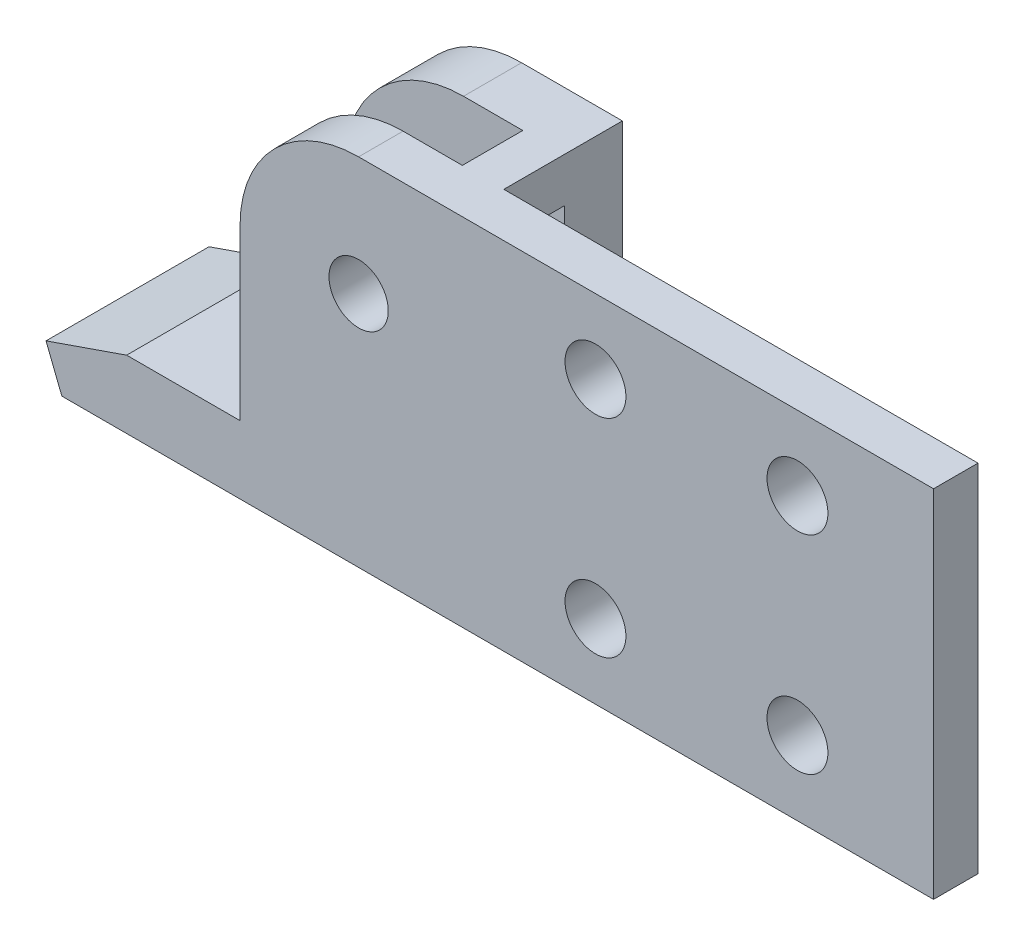
ISO-10303-21;
HEADER;
FILE_DESCRIPTION(('STEP AP214'),'2;1');
FILE_NAME('part.step','',(''),(''),'','','');
FILE_SCHEMA(('AUTOMOTIVE_DESIGN { 1 0 10303 214 1 1 1 1 }'));
ENDSEC;
DATA;
#1=APPLICATION_CONTEXT('core data for automotive mechanical design processes');
#2=APPLICATION_PROTOCOL_DEFINITION('international standard','automotive_design',2000,#1);
#3=PRODUCT_CONTEXT('',#1,'mechanical');
#4=PRODUCT('Part','Part','',(#3));
#5=PRODUCT_RELATED_PRODUCT_CATEGORY('part','',(#4));
#6=PRODUCT_DEFINITION_FORMATION('','',#4);
#7=PRODUCT_DEFINITION_CONTEXT('part definition',#1,'design');
#8=PRODUCT_DEFINITION('design','',#6,#7);
#9=PRODUCT_DEFINITION_SHAPE('','',#8);
#10=(LENGTH_UNIT() NAMED_UNIT(*) SI_UNIT(.MILLI.,.METRE.));
#11=(NAMED_UNIT(*) PLANE_ANGLE_UNIT() SI_UNIT($,.RADIAN.));
#12=(NAMED_UNIT(*) SI_UNIT($,.STERADIAN.) SOLID_ANGLE_UNIT());
#13=UNCERTAINTY_MEASURE_WITH_UNIT(LENGTH_MEASURE(1.E-05),#10,'distance_accuracy_value','');
#14=(GEOMETRIC_REPRESENTATION_CONTEXT(3) GLOBAL_UNCERTAINTY_ASSIGNED_CONTEXT((#13)) GLOBAL_UNIT_ASSIGNED_CONTEXT((#10,
#11,#12)) REPRESENTATION_CONTEXT('',''));
#15=CARTESIAN_POINT('',(0.,0.,0.));
#16=DIRECTION('',(0.,0.,1.));
#17=DIRECTION('',(1.,0.,0.));
#18=AXIS2_PLACEMENT_3D('',#15,#16,#17);
#19=CARTESIAN_POINT('',(-24.7650000000009,0.,-6.47700000000003));
#20=DIRECTION('',(0.,0.,-1.));
#21=DIRECTION('',(0.,1.,0.));
#22=AXIS2_PLACEMENT_3D('',#19,#20,#21);
#23=PLANE('',#22);
#24=DIRECTION('',(0.,-1.,0.));
#25=VECTOR('',#24,1.);
#26=CARTESIAN_POINT('',(-48.8950000000009,0.,-6.47700000000003));
#27=LINE('',#26,#25);
#28=CARTESIAN_POINT('',(-48.895000000001,-203.1333598559,-6.477));
#29=VERTEX_POINT('',#28);
#30=CARTESIAN_POINT('',(-48.895000000001,-217.052510473162,-6.477));
#31=VERTEX_POINT('',#30);
#32=EDGE_CURVE('E285',#29,#31,#27,.T.);
#33=ORIENTED_EDGE('',*,*,#32,.T.);
#34=DIRECTION('',(-1.,0.,0.));
#35=VECTOR('',#34,1.);
#36=CARTESIAN_POINT('',(-24.765000000001,-217.052510473162,-6.477));
#37=LINE('',#36,#35);
#38=CARTESIAN_POINT('',(-25.4000000000009,-217.052510473162,-6.477));
#39=VERTEX_POINT('',#38);
#40=EDGE_CURVE('E61',#39,#31,#37,.T.);
#41=ORIENTED_EDGE('',*,*,#40,.F.);
#42=DIRECTION('',(0.,-1.,0.));
#43=VECTOR('',#42,1.);
#44=CARTESIAN_POINT('',(-25.4000000000009,-190.4333598559,-6.477));
#45=LINE('',#44,#43);
#46=CARTESIAN_POINT('',(-25.4000000000009,-195.1958598559,-6.477));
#47=VERTEX_POINT('',#46);
#48=EDGE_CURVE('E46',#47,#39,#45,.T.);
#49=ORIENTED_EDGE('',*,*,#48,.F.);
#50=DIRECTION('',(-1.,0.,0.));
#51=VECTOR('',#50,1.);
#52=CARTESIAN_POINT('',(-24.765000000001,-195.1958598559,-6.477));
#53=LINE('',#52,#51);
#54=CARTESIAN_POINT('',(-29.845000000001,-195.1958598559,-6.477));
#55=VERTEX_POINT('',#54);
#56=EDGE_CURVE('E178',#47,#55,#53,.T.);
#57=ORIENTED_EDGE('',*,*,#56,.T.);
#58=DIRECTION('',(0.,-1.,0.));
#59=VECTOR('',#58,1.);
#60=CARTESIAN_POINT('',(-29.8450000000009,0.,-6.47700000000003));
#61=LINE('',#60,#59);
#62=CARTESIAN_POINT('',(-29.845000000001,-190.4333598559,-6.477));
#63=VERTEX_POINT('',#62);
#64=EDGE_CURVE('E53',#63,#55,#61,.T.);
#65=ORIENTED_EDGE('',*,*,#64,.F.);
#66=DIRECTION('',(-1.,0.,0.));
#67=VECTOR('',#66,1.);
#68=CARTESIAN_POINT('',(-29.845000000001,-190.4333598559,-6.477));
#69=LINE('',#68,#67);
#70=CARTESIAN_POINT('',(-36.195000000001,-190.4333598559,-6.477));
#71=VERTEX_POINT('',#70);
#72=EDGE_CURVE('E291',#63,#71,#69,.T.);
#73=ORIENTED_EDGE('',*,*,#72,.T.);
#74=CARTESIAN_POINT('',(-36.195000000001,-203.1333598559,-6.477));
#75=DIRECTION('',(0.,0.,-1.));
#76=DIRECTION('',(0.,1.,0.));
#77=AXIS2_PLACEMENT_3D('',#74,#75,#76);
#78=CIRCLE('',#77,12.7);
#79=EDGE_CURVE('E191',#29,#71,#78,.T.);
#80=ORIENTED_EDGE('',*,*,#79,.F.);
#81=EDGE_LOOP('',(#33,#41,#49,#57,#65,#73,#80));
#82=FACE_BOUND('',#81,.T.);
#83=CARTESIAN_POINT('',(-36.195000000001,-203.1333598559,-6.47700000000003));
#84=DIRECTION('',(0.,0.,1.));
#85=DIRECTION('',(1.,0.,0.));
#86=AXIS2_PLACEMENT_3D('',#83,#84,#85);
#87=CIRCLE('',#86,2.0193);
#88=CARTESIAN_POINT('',(-34.175700000001,-203.1333598559,-6.47700000000003));
#89=VERTEX_POINT('',#88);
#90=EDGE_CURVE('E303',#89,#89,#87,.T.);
#91=ORIENTED_EDGE('',*,*,#90,.F.);
#92=EDGE_LOOP('',(#91));
#93=FACE_BOUND('',#92,.T.);
#94=ADVANCED_FACE('F38',(#82,#93),#23,.F.);
#95=CARTESIAN_POINT('',(-36.195000000001,-203.1333598559,4.7625));
#96=DIRECTION('',(0.,0.,-1.));
#97=DIRECTION('',(-1.,0.,0.));
#98=AXIS2_PLACEMENT_3D('',#95,#96,#97);
#99=CYLINDRICAL_SURFACE('',#98,12.7);
#100=ORIENTED_EDGE('',*,*,#79,.T.);
#101=DIRECTION('',(0.,0.,-1.));
#102=VECTOR('',#101,1.);
#103=CARTESIAN_POINT('',(-36.195000000001,-190.4333598559,4.7625));
#104=LINE('',#103,#102);
#105=CARTESIAN_POINT('',(-36.195000000001,-190.4333598559,-12.7));
#106=VERTEX_POINT('',#105);
#107=EDGE_CURVE('E262',#71,#106,#104,.T.);
#108=ORIENTED_EDGE('',*,*,#107,.T.);
#109=CARTESIAN_POINT('',(-36.195000000001,-203.1333598559,-12.7));
#110=DIRECTION('',(0.,0.,-1.));
#111=DIRECTION('',(-1.,0.,0.));
#112=AXIS2_PLACEMENT_3D('',#109,#110,#111);
#113=CIRCLE('',#112,12.7);
#114=CARTESIAN_POINT('',(-48.895000000001,-203.1333598559,-12.7));
#115=VERTEX_POINT('',#114);
#116=EDGE_CURVE('E215',#115,#106,#113,.T.);
#117=ORIENTED_EDGE('',*,*,#116,.F.);
#118=DIRECTION('',(0.,0.,-1.));
#119=VECTOR('',#118,1.);
#120=CARTESIAN_POINT('',(-48.895000000001,-203.1333598559,4.7625));
#121=LINE('',#120,#119);
#122=EDGE_CURVE('E258',#29,#115,#121,.T.);
#123=ORIENTED_EDGE('',*,*,#122,.F.);
#124=EDGE_LOOP('',(#100,#108,#117,#123));
#125=FACE_BOUND('',#124,.T.);
#126=ADVANCED_FACE('F362',(#125),#99,.T.);
#127=CARTESIAN_POINT('',(-24.765000000001,-195.1958598559,0.));
#128=DIRECTION('',(0.,1.,0.));
#129=DIRECTION('',(-1.,0.,0.));
#130=AXIS2_PLACEMENT_3D('',#127,#128,#129);
#131=PLANE('',#130);
#132=DIRECTION('',(0.,0.,-1.));
#133=VECTOR('',#132,1.);
#134=CARTESIAN_POINT('',(-29.845000000001,-195.1958598559,0.));
#135=LINE('',#134,#133);
#136=CARTESIAN_POINT('',(-29.845000000001,-195.1958598559,0.));
#137=VERTEX_POINT('',#136);
#138=EDGE_CURVE('E156',#137,#55,#135,.T.);
#139=ORIENTED_EDGE('',*,*,#138,.T.);
#140=ORIENTED_EDGE('',*,*,#56,.F.);
#141=DIRECTION('',(0.,0.,-1.));
#142=VECTOR('',#141,1.);
#143=CARTESIAN_POINT('',(-25.4000000000009,-195.1958598559,-12.7));
#144=LINE('',#143,#142);
#145=CARTESIAN_POINT('',(-25.4000000000009,-195.1958598559,0.));
#146=VERTEX_POINT('',#145);
#147=EDGE_CURVE('E11',#146,#47,#144,.T.);
#148=ORIENTED_EDGE('',*,*,#147,.F.);
#149=DIRECTION('',(-1.,0.,0.));
#150=VECTOR('',#149,1.);
#151=CARTESIAN_POINT('',(-24.765000000001,-195.1958598559,0.));
#152=LINE('',#151,#150);
#153=EDGE_CURVE('E171',#146,#137,#152,.T.);
#154=ORIENTED_EDGE('',*,*,#153,.T.);
#155=EDGE_LOOP('',(#139,#140,#148,#154));
#156=FACE_BOUND('',#155,.T.);
#157=ADVANCED_FACE('F177',(#156),#131,.F.);
#158=CARTESIAN_POINT('',(-36.195000000001,-203.1333598559,0.));
#159=DIRECTION('',(0.,0.,1.));
#160=DIRECTION('',(1.,0.,0.));
#161=AXIS2_PLACEMENT_3D('',#158,#159,#160);
#162=PLANE('',#161);
#163=CARTESIAN_POINT('',(-10.8204,-198.3708598559,0.));
#164=DIRECTION('',(0.,0.,1.));
#165=DIRECTION('',(1.,0.,0.));
#166=AXIS2_PLACEMENT_3D('',#163,#164,#165);
#167=CIRCLE('',#166,3.2639);
#168=CARTESIAN_POINT('',(-7.5565,-198.3708598559,0.));
#169=VERTEX_POINT('',#168);
#170=EDGE_CURVE('E324',#169,#169,#167,.T.);
#171=ORIENTED_EDGE('',*,*,#170,.T.);
#172=EDGE_LOOP('',(#171));
#173=FACE_BOUND('',#172,.T.);
#174=CARTESIAN_POINT('',(-10.8204,-220.5958598559,0.));
#175=DIRECTION('',(0.,0.,1.));
#176=DIRECTION('',(1.,0.,0.));
#177=AXIS2_PLACEMENT_3D('',#174,#175,#176);
#178=CIRCLE('',#177,3.2639);
#179=CARTESIAN_POINT('',(-7.5565,-220.5958598559,0.));
#180=VERTEX_POINT('',#179);
#181=EDGE_CURVE('E318',#180,#180,#178,.T.);
#182=ORIENTED_EDGE('',*,*,#181,.T.);
#183=EDGE_LOOP('',(#182));
#184=FACE_BOUND('',#183,.T.);
#185=CARTESIAN_POINT('',(10.8204,-220.5958598559,0.));
#186=DIRECTION('',(0.,0.,1.));
#187=DIRECTION('',(1.,0.,0.));
#188=AXIS2_PLACEMENT_3D('',#185,#186,#187);
#189=CIRCLE('',#188,3.2639);
#190=CARTESIAN_POINT('',(14.0843,-220.5958598559,0.));
#191=VERTEX_POINT('',#190);
#192=EDGE_CURVE('E312',#191,#191,#189,.T.);
#193=ORIENTED_EDGE('',*,*,#192,.T.);
#194=EDGE_LOOP('',(#193));
#195=FACE_BOUND('',#194,.T.);
#196=CARTESIAN_POINT('',(10.8204,-198.3708598559,0.));
#197=DIRECTION('',(0.,0.,1.));
#198=DIRECTION('',(1.,0.,0.));
#199=AXIS2_PLACEMENT_3D('',#196,#197,#198);
#200=CIRCLE('',#199,3.2639);
#201=CARTESIAN_POINT('',(14.0843,-198.3708598559,0.));
#202=VERTEX_POINT('',#201);
#203=EDGE_CURVE('E306',#202,#202,#200,.T.);
#204=ORIENTED_EDGE('',*,*,#203,.T.);
#205=EDGE_LOOP('',(#204));
#206=FACE_BOUND('',#205,.T.);
#207=ORIENTED_EDGE('',*,*,#153,.F.);
#208=DIRECTION('',(0.,-1.,0.));
#209=VECTOR('',#208,1.);
#210=CARTESIAN_POINT('',(-25.4000000000009,-190.4333598559,0.));
#211=LINE('',#210,#209);
#212=CARTESIAN_POINT('',(-25.4000000000009,-190.4333598559,0.));
#213=VERTEX_POINT('',#212);
#214=EDGE_CURVE('E198',#213,#146,#211,.T.);
#215=ORIENTED_EDGE('',*,*,#214,.F.);
#216=DIRECTION('',(-1.,0.,0.));
#217=VECTOR('',#216,1.);
#218=CARTESIAN_POINT('',(-36.195000000001,-190.4333598559,0.));
#219=LINE('',#218,#217);
#220=CARTESIAN_POINT('',(25.3999999999991,-190.4333598559,0.));
#221=VERTEX_POINT('',#220);
#222=EDGE_CURVE('E235',#221,#213,#219,.T.);
#223=ORIENTED_EDGE('',*,*,#222,.F.);
#224=DIRECTION('',(0.,1.,0.));
#225=VECTOR('',#224,1.);
#226=CARTESIAN_POINT('',(25.3999999999991,-190.4333598559,0.));
#227=LINE('',#226,#225);
#228=CARTESIAN_POINT('',(25.3999999999991,-228.533359855901,0.));
#229=VERTEX_POINT('',#228);
#230=EDGE_CURVE('E251',#229,#221,#227,.T.);
#231=ORIENTED_EDGE('',*,*,#230,.F.);
#232=DIRECTION('',(1.,0.,0.));
#233=VECTOR('',#232,1.);
#234=CARTESIAN_POINT('',(25.3999999999991,-228.533359855901,0.));
#235=LINE('',#234,#233);
#236=CARTESIAN_POINT('',(-25.4000000000009,-228.533359855901,0.));
#237=VERTEX_POINT('',#236);
#238=EDGE_CURVE('E228',#237,#229,#235,.T.);
#239=ORIENTED_EDGE('',*,*,#238,.F.);
#240=CARTESIAN_POINT('',(-25.4000000000009,-217.052510473162,0.));
#241=VERTEX_POINT('',#240);
#242=EDGE_CURVE('E193',#241,#237,#211,.T.);
#243=ORIENTED_EDGE('',*,*,#242,.F.);
#244=DIRECTION('',(-1.,0.,0.));
#245=VECTOR('',#244,1.);
#246=CARTESIAN_POINT('',(-24.765000000001,-217.052510473162,0.));
#247=LINE('',#246,#245);
#248=CARTESIAN_POINT('',(-48.895000000001,-217.052510473162,0.));
#249=VERTEX_POINT('',#248);
#250=EDGE_CURVE('E179',#241,#249,#247,.T.);
#251=ORIENTED_EDGE('',*,*,#250,.T.);
#252=DIRECTION('',(0.,1.,0.));
#253=VECTOR('',#252,1.);
#254=CARTESIAN_POINT('',(-48.8950000000009,0.,0.));
#255=LINE('',#254,#253);
#256=CARTESIAN_POINT('',(-48.895000000001,-203.1333598559,0.));
#257=VERTEX_POINT('',#256);
#258=EDGE_CURVE('E187',#249,#257,#255,.T.);
#259=ORIENTED_EDGE('',*,*,#258,.T.);
#260=CARTESIAN_POINT('',(-36.195000000001,-203.1333598559,0.));
#261=DIRECTION('',(0.,0.,1.));
#262=DIRECTION('',(1.,0.,0.));
#263=AXIS2_PLACEMENT_3D('',#260,#261,#262);
#264=CIRCLE('',#263,12.7);
#265=CARTESIAN_POINT('',(-36.195000000001,-190.4333598559,0.));
#266=VERTEX_POINT('',#265);
#267=EDGE_CURVE('E181',#266,#257,#264,.T.);
#268=ORIENTED_EDGE('',*,*,#267,.F.);
#269=DIRECTION('',(-1.,0.,0.));
#270=VECTOR('',#269,1.);
#271=CARTESIAN_POINT('',(-29.845000000001,-190.4333598559,0.));
#272=LINE('',#271,#270);
#273=CARTESIAN_POINT('',(-29.845000000001,-190.4333598559,0.));
#274=VERTEX_POINT('',#273);
#275=EDGE_CURVE('E174',#274,#266,#272,.T.);
#276=ORIENTED_EDGE('',*,*,#275,.F.);
#277=DIRECTION('',(0.,1.,0.));
#278=VECTOR('',#277,1.);
#279=CARTESIAN_POINT('',(-29.8450000000009,0.,0.));
#280=LINE('',#279,#278);
#281=EDGE_CURVE('E159',#137,#274,#280,.T.);
#282=ORIENTED_EDGE('',*,*,#281,.F.);
#283=EDGE_LOOP('',(#207,#215,#223,#231,#239,#243,#251,#259,#268,#276,#282));
#284=FACE_BOUND('',#283,.T.);
#285=CARTESIAN_POINT('',(-36.195000000001,-203.1333598559,0.));
#286=DIRECTION('',(0.,0.,1.));
#287=DIRECTION('',(1.,0.,0.));
#288=AXIS2_PLACEMENT_3D('',#285,#286,#287);
#289=CIRCLE('',#288,3.175);
#290=CARTESIAN_POINT('',(-39.370000000001,-203.1333598559,0.));
#291=VERTEX_POINT('',#290);
#292=EDGE_CURVE('E190',#291,#291,#289,.T.);
#293=ORIENTED_EDGE('',*,*,#292,.T.);
#294=EDGE_LOOP('',(#293));
#295=FACE_BOUND('',#294,.T.);
#296=ADVANCED_FACE('F169',(#173,#184,#195,#206,#284,#295),#162,.F.);
#297=CARTESIAN_POINT('',(-36.195000000001,-203.1333598559,4.7625));
#298=DIRECTION('',(0.,0.,1.));
#299=DIRECTION('',(1.,0.,0.));
#300=AXIS2_PLACEMENT_3D('',#297,#298,#299);
#301=PLANE('',#300);
#302=CARTESIAN_POINT('',(-10.8204,-198.3708598559,4.7625));
#303=DIRECTION('',(0.,0.,1.));
#304=DIRECTION('',(1.,0.,0.));
#305=AXIS2_PLACEMENT_3D('',#302,#303,#304);
#306=CIRCLE('',#305,3.2639);
#307=CARTESIAN_POINT('',(-7.5565,-198.3708598559,4.7625));
#308=VERTEX_POINT('',#307);
#309=EDGE_CURVE('E327',#308,#308,#306,.T.);
#310=ORIENTED_EDGE('',*,*,#309,.F.);
#311=EDGE_LOOP('',(#310));
#312=FACE_BOUND('',#311,.T.);
#313=CARTESIAN_POINT('',(-10.8204,-220.5958598559,4.7625));
#314=DIRECTION('',(0.,0.,1.));
#315=DIRECTION('',(1.,0.,0.));
#316=AXIS2_PLACEMENT_3D('',#313,#314,#315);
#317=CIRCLE('',#316,3.2639);
#318=CARTESIAN_POINT('',(-7.5565,-220.5958598559,4.7625));
#319=VERTEX_POINT('',#318);
#320=EDGE_CURVE('E321',#319,#319,#317,.T.);
#321=ORIENTED_EDGE('',*,*,#320,.F.);
#322=EDGE_LOOP('',(#321));
#323=FACE_BOUND('',#322,.T.);
#324=CARTESIAN_POINT('',(10.8204,-220.5958598559,4.7625));
#325=DIRECTION('',(0.,0.,1.));
#326=DIRECTION('',(1.,0.,0.));
#327=AXIS2_PLACEMENT_3D('',#324,#325,#326);
#328=CIRCLE('',#327,3.2639);
#329=CARTESIAN_POINT('',(14.0843,-220.5958598559,4.7625));
#330=VERTEX_POINT('',#329);
#331=EDGE_CURVE('E315',#330,#330,#328,.T.);
#332=ORIENTED_EDGE('',*,*,#331,.F.);
#333=EDGE_LOOP('',(#332));
#334=FACE_BOUND('',#333,.T.);
#335=CARTESIAN_POINT('',(10.8204,-198.3708598559,4.7625));
#336=DIRECTION('',(0.,0.,1.));
#337=DIRECTION('',(1.,0.,0.));
#338=AXIS2_PLACEMENT_3D('',#335,#336,#337);
#339=CIRCLE('',#338,3.2639);
#340=CARTESIAN_POINT('',(14.0843,-198.3708598559,4.7625));
#341=VERTEX_POINT('',#340);
#342=EDGE_CURVE('E309',#341,#341,#339,.T.);
#343=ORIENTED_EDGE('',*,*,#342,.F.);
#344=EDGE_LOOP('',(#343));
#345=FACE_BOUND('',#344,.T.);
#346=DIRECTION('',(-0.944948295670195,-0.327219679282884,0.));
#347=VECTOR('',#346,1.);
#348=CARTESIAN_POINT('',(-69.6868563657894,-224.252380141043,4.7625));
#349=LINE('',#348,#347);
#350=CARTESIAN_POINT('',(-61.0470257996289,-221.260552334303,4.7625));
#351=VERTEX_POINT('',#350);
#352=CARTESIAN_POINT('',(-69.6868563657894,-224.252380141043,4.7625));
#353=VERTEX_POINT('',#352);
#354=EDGE_CURVE('E231',#351,#353,#349,.T.);
#355=ORIENTED_EDGE('',*,*,#354,.T.);
#356=DIRECTION('',(0.369195948458416,-0.929351575907573,0.));
#357=VECTOR('',#356,1.);
#358=CARTESIAN_POINT('',(-67.9861863425909,-228.533359855901,4.7625));
#359=LINE('',#358,#357);
#360=CARTESIAN_POINT('',(-67.9861863425909,-228.533359855901,4.7625));
#361=VERTEX_POINT('',#360);
#362=EDGE_CURVE('E234',#353,#361,#359,.T.);
#363=ORIENTED_EDGE('',*,*,#362,.T.);
#364=DIRECTION('',(1.,0.,0.));
#365=VECTOR('',#364,1.);
#366=CARTESIAN_POINT('',(25.3999999999991,-228.533359855901,4.7625));
#367=LINE('',#366,#365);
#368=CARTESIAN_POINT('',(25.3999999999991,-228.533359855901,4.7625));
#369=VERTEX_POINT('',#368);
#370=EDGE_CURVE('E237',#361,#369,#367,.T.);
#371=ORIENTED_EDGE('',*,*,#370,.T.);
#372=DIRECTION('',(0.,1.,0.));
#373=VECTOR('',#372,1.);
#374=CARTESIAN_POINT('',(25.3999999999991,-190.4333598559,4.7625));
#375=LINE('',#374,#373);
#376=CARTESIAN_POINT('',(25.3999999999991,-190.4333598559,4.7625));
#377=VERTEX_POINT('',#376);
#378=EDGE_CURVE('E239',#369,#377,#375,.T.);
#379=ORIENTED_EDGE('',*,*,#378,.T.);
#380=DIRECTION('',(-1.,0.,0.));
#381=VECTOR('',#380,1.);
#382=CARTESIAN_POINT('',(-36.195000000001,-190.4333598559,4.7625));
#383=LINE('',#382,#381);
#384=CARTESIAN_POINT('',(-36.195000000001,-190.4333598559,4.7625));
#385=VERTEX_POINT('',#384);
#386=EDGE_CURVE('E241',#377,#385,#383,.T.);
#387=ORIENTED_EDGE('',*,*,#386,.T.);
#388=CARTESIAN_POINT('',(-36.195000000001,-203.1333598559,4.7625));
#389=DIRECTION('',(0.,0.,1.));
#390=DIRECTION('',(1.,0.,0.));
#391=AXIS2_PLACEMENT_3D('',#388,#389,#390);
#392=CIRCLE('',#391,12.7);
#393=CARTESIAN_POINT('',(-48.895000000001,-203.1333598559,4.7625));
#394=VERTEX_POINT('',#393);
#395=EDGE_CURVE('E243',#385,#394,#392,.T.);
#396=ORIENTED_EDGE('',*,*,#395,.T.);
#397=DIRECTION('',(0.,-1.,0.));
#398=VECTOR('',#397,1.);
#399=CARTESIAN_POINT('',(-48.895000000001,-221.260552334303,4.7625));
#400=LINE('',#399,#398);
#401=CARTESIAN_POINT('',(-48.895000000001,-221.260552334303,4.7625));
#402=VERTEX_POINT('',#401);
#403=EDGE_CURVE('E245',#394,#402,#400,.T.);
#404=ORIENTED_EDGE('',*,*,#403,.T.);
#405=DIRECTION('',(-1.,0.,0.));
#406=VECTOR('',#405,1.);
#407=CARTESIAN_POINT('',(-61.0470257996289,-221.260552334303,4.7625));
#408=LINE('',#407,#406);
#409=EDGE_CURVE('E247',#402,#351,#408,.T.);
#410=ORIENTED_EDGE('',*,*,#409,.T.);
#411=EDGE_LOOP('',(#355,#363,#371,#379,#387,#396,#404,#410));
#412=FACE_BOUND('',#411,.T.);
#413=CARTESIAN_POINT('',(-36.195000000001,-203.1333598559,4.7625));
#414=DIRECTION('',(0.,0.,1.));
#415=DIRECTION('',(1.,0.,0.));
#416=AXIS2_PLACEMENT_3D('',#413,#414,#415);
#417=CIRCLE('',#416,3.175);
#418=CARTESIAN_POINT('',(-39.370000000001,-203.1333598559,4.7625));
#419=VERTEX_POINT('',#418);
#420=EDGE_CURVE('E225',#419,#419,#417,.T.);
#421=ORIENTED_EDGE('',*,*,#420,.F.);
#422=EDGE_LOOP('',(#421));
#423=FACE_BOUND('',#422,.T.);
#424=ADVANCED_FACE('F334',(#312,#323,#334,#345,#412,#423),#301,.T.);
#425=CARTESIAN_POINT('',(-69.6868563657894,-224.252380141043,4.7625));
#426=DIRECTION('',(0.327219679282884,-0.944948295670195,0.));
#427=DIRECTION('',(0.944948295670195,0.327219679282884,0.));
#428=AXIS2_PLACEMENT_3D('',#425,#426,#427);
#429=PLANE('',#428);
#430=DIRECTION('',(0.,0.,-1.));
#431=VECTOR('',#430,1.);
#432=CARTESIAN_POINT('',(-61.0470257996289,-221.260552334303,4.7625));
#433=LINE('',#432,#431);
#434=CARTESIAN_POINT('',(-61.0470257996289,-221.260552334303,-12.7));
#435=VERTEX_POINT('',#434);
#436=EDGE_CURVE('E249',#351,#435,#433,.T.);
#437=ORIENTED_EDGE('',*,*,#436,.T.);
#438=DIRECTION('',(0.944948295670195,0.327219679282884,0.));
#439=VECTOR('',#438,1.);
#440=CARTESIAN_POINT('',(-69.6868563657894,-224.252380141043,-12.7));
#441=LINE('',#440,#439);
#442=CARTESIAN_POINT('',(-69.6868563657894,-224.252380141043,-12.7));
#443=VERTEX_POINT('',#442);
#444=EDGE_CURVE('E206',#443,#435,#441,.T.);
#445=ORIENTED_EDGE('',*,*,#444,.F.);
#446=DIRECTION('',(0.,0.,-1.));
#447=VECTOR('',#446,1.);
#448=CARTESIAN_POINT('',(-69.6868563657894,-224.252380141043,4.7625));
#449=LINE('',#448,#447);
#450=EDGE_CURVE('E274',#353,#443,#449,.T.);
#451=ORIENTED_EDGE('',*,*,#450,.F.);
#452=ORIENTED_EDGE('',*,*,#354,.F.);
#453=EDGE_LOOP('',(#437,#445,#451,#452));
#454=FACE_BOUND('',#453,.T.);
#455=ADVANCED_FACE('F40',(#454),#429,.F.);
#456=CARTESIAN_POINT('',(-67.9861863425909,-228.533359855901,4.7625));
#457=DIRECTION('',(0.929351575907574,0.369195948458417,0.));
#458=DIRECTION('',(-0.369195948458417,0.929351575907574,0.));
#459=AXIS2_PLACEMENT_3D('',#456,#457,#458);
#460=PLANE('',#459);
#461=ORIENTED_EDGE('',*,*,#450,.T.);
#462=DIRECTION('',(-0.369195948458416,0.929351575907573,0.));
#463=VECTOR('',#462,1.);
#464=CARTESIAN_POINT('',(-67.9861863425909,-228.533359855901,-12.7));
#465=LINE('',#464,#463);
#466=CARTESIAN_POINT('',(-67.9861863425909,-228.533359855901,-12.7));
#467=VERTEX_POINT('',#466);
#468=EDGE_CURVE('E203',#467,#443,#465,.T.);
#469=ORIENTED_EDGE('',*,*,#468,.F.);
#470=DIRECTION('',(0.,0.,-1.));
#471=VECTOR('',#470,1.);
#472=CARTESIAN_POINT('',(-67.9861863425909,-228.533359855901,4.7625));
#473=LINE('',#472,#471);
#474=EDGE_CURVE('E272',#361,#467,#473,.T.);
#475=ORIENTED_EDGE('',*,*,#474,.F.);
#476=ORIENTED_EDGE('',*,*,#362,.F.);
#477=EDGE_LOOP('',(#461,#469,#475,#476));
#478=FACE_BOUND('',#477,.T.);
#479=ADVANCED_FACE('F454',(#478),#460,.F.);
#480=CARTESIAN_POINT('',(25.3999999999991,-228.533359855901,4.7625));
#481=DIRECTION('',(0.,1.,0.));
#482=DIRECTION('',(0.,0.,1.));
#483=AXIS2_PLACEMENT_3D('',#480,#481,#482);
#484=PLANE('',#483);
#485=ORIENTED_EDGE('',*,*,#474,.T.);
#486=DIRECTION('',(-1.,0.,0.));
#487=VECTOR('',#486,1.);
#488=CARTESIAN_POINT('',(-25.4000000000009,-228.533359855901,-12.7));
#489=LINE('',#488,#487);
#490=CARTESIAN_POINT('',(-25.4000000000009,-228.533359855901,-12.7));
#491=VERTEX_POINT('',#490);
#492=EDGE_CURVE('E200',#491,#467,#489,.T.);
#493=ORIENTED_EDGE('',*,*,#492,.F.);
#494=DIRECTION('',(0.,0.,1.));
#495=VECTOR('',#494,1.);
#496=CARTESIAN_POINT('',(-25.4000000000009,-228.533359855901,-12.7));
#497=LINE('',#496,#495);
#498=EDGE_CURVE('E218',#491,#237,#497,.T.);
#499=ORIENTED_EDGE('',*,*,#498,.T.);
#500=ORIENTED_EDGE('',*,*,#238,.T.);
#501=DIRECTION('',(0.,0.,-1.));
#502=VECTOR('',#501,1.);
#503=CARTESIAN_POINT('',(25.3999999999991,-228.533359855901,4.7625));
#504=LINE('',#503,#502);
#505=EDGE_CURVE('E269',#369,#229,#504,.T.);
#506=ORIENTED_EDGE('',*,*,#505,.F.);
#507=ORIENTED_EDGE('',*,*,#370,.F.);
#508=EDGE_LOOP('',(#485,#493,#499,#500,#506,#507));
#509=FACE_BOUND('',#508,.T.);
#510=ADVANCED_FACE('F462',(#509),#484,.F.);
#511=CARTESIAN_POINT('',(25.3999999999991,-190.4333598559,4.7625));
#512=DIRECTION('',(-1.,0.,0.));
#513=DIRECTION('',(0.,-1.,0.));
#514=AXIS2_PLACEMENT_3D('',#511,#512,#513);
#515=PLANE('',#514);
#516=ORIENTED_EDGE('',*,*,#230,.T.);
#517=DIRECTION('',(0.,0.,-1.));
#518=VECTOR('',#517,1.);
#519=CARTESIAN_POINT('',(25.3999999999991,-190.4333598559,4.7625));
#520=LINE('',#519,#518);
#521=EDGE_CURVE('E266',#377,#221,#520,.T.);
#522=ORIENTED_EDGE('',*,*,#521,.F.);
#523=ORIENTED_EDGE('',*,*,#378,.F.);
#524=ORIENTED_EDGE('',*,*,#505,.T.);
#525=EDGE_LOOP('',(#516,#522,#523,#524));
#526=FACE_BOUND('',#525,.T.);
#527=ADVANCED_FACE('F469',(#526),#515,.F.);
#528=CARTESIAN_POINT('',(-36.195000000001,-190.4333598559,4.7625));
#529=DIRECTION('',(0.,-1.,0.));
#530=DIRECTION('',(0.,0.,-1.));
#531=AXIS2_PLACEMENT_3D('',#528,#529,#530);
#532=PLANE('',#531);
#533=ORIENTED_EDGE('',*,*,#107,.F.);
#534=ORIENTED_EDGE('',*,*,#72,.F.);
#535=DIRECTION('',(0.,0.,-1.));
#536=VECTOR('',#535,1.);
#537=CARTESIAN_POINT('',(-29.845000000001,-190.4333598559,0.));
#538=LINE('',#537,#536);
#539=EDGE_CURVE('E175',#274,#63,#538,.T.);
#540=ORIENTED_EDGE('',*,*,#539,.F.);
#541=ORIENTED_EDGE('',*,*,#275,.T.);
#542=EDGE_CURVE('E263',#385,#266,#104,.T.);
#543=ORIENTED_EDGE('',*,*,#542,.F.);
#544=ORIENTED_EDGE('',*,*,#386,.F.);
#545=ORIENTED_EDGE('',*,*,#521,.T.);
#546=ORIENTED_EDGE('',*,*,#222,.T.);
#547=DIRECTION('',(0.,0.,1.));
#548=VECTOR('',#547,1.);
#549=CARTESIAN_POINT('',(-25.4000000000009,-190.4333598559,-12.7));
#550=LINE('',#549,#548);
#551=CARTESIAN_POINT('',(-25.4000000000009,-190.4333598559,-12.7));
#552=VERTEX_POINT('',#551);
#553=EDGE_CURVE('E222',#552,#213,#550,.T.);
#554=ORIENTED_EDGE('',*,*,#553,.F.);
#555=DIRECTION('',(1.,0.,0.));
#556=VECTOR('',#555,1.);
#557=CARTESIAN_POINT('',(-36.195000000001,-190.4333598559,-12.7));
#558=LINE('',#557,#556);
#559=EDGE_CURVE('E194',#106,#552,#558,.T.);
#560=ORIENTED_EDGE('',*,*,#559,.F.);
#561=EDGE_LOOP('',(#533,#534,#540,#541,#543,#544,#545,#546,#554,#560));
#562=FACE_BOUND('',#561,.T.);
#563=ADVANCED_FACE('F478',(#562),#532,.F.);
#564=ORIENTED_EDGE('',*,*,#542,.T.);
#565=ORIENTED_EDGE('',*,*,#267,.T.);
#566=EDGE_CURVE('E259',#394,#257,#121,.T.);
#567=ORIENTED_EDGE('',*,*,#566,.F.);
#568=ORIENTED_EDGE('',*,*,#395,.F.);
#569=EDGE_LOOP('',(#564,#565,#567,#568));
#570=FACE_BOUND('',#569,.T.);
#571=ADVANCED_FACE('F373',(#570),#99,.T.);
#572=CARTESIAN_POINT('',(-48.895000000001,-221.260552334303,4.7625));
#573=DIRECTION('',(1.,0.,0.));
#574=DIRECTION('',(0.,1.,0.));
#575=AXIS2_PLACEMENT_3D('',#572,#573,#574);
#576=PLANE('',#575);
#577=DIRECTION('',(0.,0.,1.));
#578=VECTOR('',#577,1.);
#579=CARTESIAN_POINT('',(-48.895000000001,-217.052510473162,0.));
#580=LINE('',#579,#578);
#581=EDGE_CURVE('E290',#31,#249,#580,.T.);
#582=ORIENTED_EDGE('',*,*,#581,.F.);
#583=ORIENTED_EDGE('',*,*,#32,.F.);
#584=ORIENTED_EDGE('',*,*,#122,.T.);
#585=DIRECTION('',(0.,1.,0.));
#586=VECTOR('',#585,1.);
#587=CARTESIAN_POINT('',(-48.895000000001,-221.260552334303,-12.7));
#588=LINE('',#587,#586);
#589=CARTESIAN_POINT('',(-48.895000000001,-221.260552334303,-12.7));
#590=VERTEX_POINT('',#589);
#591=EDGE_CURVE('E212',#590,#115,#588,.T.);
#592=ORIENTED_EDGE('',*,*,#591,.F.);
#593=DIRECTION('',(0.,0.,-1.));
#594=VECTOR('',#593,1.);
#595=CARTESIAN_POINT('',(-48.895000000001,-221.260552334303,4.7625));
#596=LINE('',#595,#594);
#597=EDGE_CURVE('E256',#402,#590,#596,.T.);
#598=ORIENTED_EDGE('',*,*,#597,.F.);
#599=ORIENTED_EDGE('',*,*,#403,.F.);
#600=ORIENTED_EDGE('',*,*,#566,.T.);
#601=ORIENTED_EDGE('',*,*,#258,.F.);
#602=EDGE_LOOP('',(#582,#583,#584,#592,#598,#599,#600,#601));
#603=FACE_BOUND('',#602,.T.);
#604=ADVANCED_FACE('F294',(#603),#576,.F.);
#605=CARTESIAN_POINT('',(-61.0470257996289,-221.260552334303,4.7625));
#606=DIRECTION('',(0.,-1.,0.));
#607=DIRECTION('',(0.,0.,-1.));
#608=AXIS2_PLACEMENT_3D('',#605,#606,#607);
#609=PLANE('',#608);
#610=ORIENTED_EDGE('',*,*,#597,.T.);
#611=DIRECTION('',(1.,0.,0.));
#612=VECTOR('',#611,1.);
#613=CARTESIAN_POINT('',(-61.0470257996289,-221.260552334303,-12.7));
#614=LINE('',#613,#612);
#615=EDGE_CURVE('E209',#435,#590,#614,.T.);
#616=ORIENTED_EDGE('',*,*,#615,.F.);
#617=ORIENTED_EDGE('',*,*,#436,.F.);
#618=ORIENTED_EDGE('',*,*,#409,.F.);
#619=EDGE_LOOP('',(#610,#616,#617,#618));
#620=FACE_BOUND('',#619,.T.);
#621=ADVANCED_FACE('F353',(#620),#609,.F.);
#622=CARTESIAN_POINT('',(-36.195000000001,-203.1333598559,4.7625));
#623=DIRECTION('',(0.,0.,-1.));
#624=DIRECTION('',(-1.,0.,0.));
#625=AXIS2_PLACEMENT_3D('',#622,#623,#624);
#626=CYLINDRICAL_SURFACE('',#625,3.175);
#627=CARTESIAN_POINT('',(-39.370000000001,-203.1333598559,4.7625));
#628=CARTESIAN_POINT('',(-39.370000000001,-203.1333598559,4.712890625));
#629=CARTESIAN_POINT('',(-39.370000000001,-203.1333598559,4.66328125));
#630=CARTESIAN_POINT('',(-39.370000000001,-203.1333598559,4.5640625));
#631=CARTESIAN_POINT('',(-39.370000000001,-203.1333598559,4.514453125));
#632=CARTESIAN_POINT('',(-39.370000000001,-203.1333598559,4.415234375));
#633=CARTESIAN_POINT('',(-39.370000000001,-203.1333598559,4.365625));
#634=CARTESIAN_POINT('',(-39.370000000001,-203.1333598559,4.26640625));
#635=CARTESIAN_POINT('',(-39.370000000001,-203.1333598559,4.216796875));
#636=CARTESIAN_POINT('',(-39.370000000001,-203.1333598559,4.117578125));
#637=CARTESIAN_POINT('',(-39.370000000001,-203.1333598559,4.06796875));
#638=CARTESIAN_POINT('',(-39.370000000001,-203.1333598559,3.96875));
#639=CARTESIAN_POINT('',(-39.370000000001,-203.1333598559,3.919140625));
#640=CARTESIAN_POINT('',(-39.370000000001,-203.1333598559,3.819921875));
#641=CARTESIAN_POINT('',(-39.370000000001,-203.1333598559,3.7703125));
#642=CARTESIAN_POINT('',(-39.370000000001,-203.1333598559,3.67109375));
#643=CARTESIAN_POINT('',(-39.370000000001,-203.1333598559,3.621484375));
#644=CARTESIAN_POINT('',(-39.370000000001,-203.1333598559,3.522265625));
#645=CARTESIAN_POINT('',(-39.370000000001,-203.1333598559,3.47265625));
#646=CARTESIAN_POINT('',(-39.370000000001,-203.1333598559,3.3734375));
#647=CARTESIAN_POINT('',(-39.370000000001,-203.1333598559,3.323828125));
#648=CARTESIAN_POINT('',(-39.370000000001,-203.1333598559,3.224609375));
#649=CARTESIAN_POINT('',(-39.370000000001,-203.1333598559,3.175));
#650=CARTESIAN_POINT('',(-39.370000000001,-203.1333598559,3.07578125));
#651=CARTESIAN_POINT('',(-39.370000000001,-203.1333598559,3.026171875));
#652=CARTESIAN_POINT('',(-39.370000000001,-203.1333598559,2.926953125));
#653=CARTESIAN_POINT('',(-39.370000000001,-203.1333598559,2.87734375));
#654=CARTESIAN_POINT('',(-39.370000000001,-203.1333598559,2.778125));
#655=CARTESIAN_POINT('',(-39.370000000001,-203.1333598559,2.728515625));
#656=CARTESIAN_POINT('',(-39.370000000001,-203.1333598559,2.629296875));
#657=CARTESIAN_POINT('',(-39.370000000001,-203.1333598559,2.5796875));
#658=CARTESIAN_POINT('',(-39.370000000001,-203.1333598559,2.48046875));
#659=CARTESIAN_POINT('',(-39.370000000001,-203.1333598559,2.430859375));
#660=CARTESIAN_POINT('',(-39.370000000001,-203.1333598559,2.331640625));
#661=CARTESIAN_POINT('',(-39.370000000001,-203.1333598559,2.28203125));
#662=CARTESIAN_POINT('',(-39.370000000001,-203.1333598559,2.1828125));
#663=CARTESIAN_POINT('',(-39.370000000001,-203.1333598559,2.133203125));
#664=CARTESIAN_POINT('',(-39.370000000001,-203.1333598559,2.033984375));
#665=CARTESIAN_POINT('',(-39.370000000001,-203.1333598559,1.984375));
#666=CARTESIAN_POINT('',(-39.370000000001,-203.1333598559,1.88515625));
#667=CARTESIAN_POINT('',(-39.370000000001,-203.1333598559,1.835546875));
#668=CARTESIAN_POINT('',(-39.370000000001,-203.1333598559,1.736328125));
#669=CARTESIAN_POINT('',(-39.370000000001,-203.1333598559,1.68671875));
#670=CARTESIAN_POINT('',(-39.370000000001,-203.1333598559,1.5875));
#671=CARTESIAN_POINT('',(-39.370000000001,-203.1333598559,1.537890625));
#672=CARTESIAN_POINT('',(-39.370000000001,-203.1333598559,1.438671875));
#673=CARTESIAN_POINT('',(-39.370000000001,-203.1333598559,1.3890625));
#674=CARTESIAN_POINT('',(-39.370000000001,-203.1333598559,1.28984375));
#675=CARTESIAN_POINT('',(-39.370000000001,-203.1333598559,1.240234375));
#676=CARTESIAN_POINT('',(-39.370000000001,-203.1333598559,1.141015625));
#677=CARTESIAN_POINT('',(-39.370000000001,-203.1333598559,1.09140625));
#678=CARTESIAN_POINT('',(-39.370000000001,-203.1333598559,0.9921875));
#679=CARTESIAN_POINT('',(-39.370000000001,-203.1333598559,0.942578125));
#680=CARTESIAN_POINT('',(-39.370000000001,-203.1333598559,0.843359375));
#681=CARTESIAN_POINT('',(-39.370000000001,-203.1333598559,0.79375));
#682=CARTESIAN_POINT('',(-39.370000000001,-203.1333598559,0.69453125));
#683=CARTESIAN_POINT('',(-39.370000000001,-203.1333598559,0.644921875));
#684=CARTESIAN_POINT('',(-39.370000000001,-203.1333598559,0.545703125));
#685=CARTESIAN_POINT('',(-39.370000000001,-203.1333598559,0.49609375));
#686=CARTESIAN_POINT('',(-39.370000000001,-203.1333598559,0.396875));
#687=CARTESIAN_POINT('',(-39.370000000001,-203.1333598559,0.347265625));
#688=CARTESIAN_POINT('',(-39.370000000001,-203.1333598559,0.248046875));
#689=CARTESIAN_POINT('',(-39.370000000001,-203.1333598559,0.1984375));
#690=CARTESIAN_POINT('',(-39.370000000001,-203.1333598559,0.09921875));
#691=CARTESIAN_POINT('',(-39.370000000001,-203.1333598559,0.049609375));
#692=CARTESIAN_POINT('',(-39.370000000001,-203.1333598559,0.));
#693=B_SPLINE_CURVE_WITH_KNOTS('',3,(#627,#628,#629,#630,#631,#632,#633,#634,#635,#636,#637,
#638,#639,#640,#641,#642,#643,#644,#645,#646,#647,#648,#649,#650,#651,#652,#653,#654,#655,#656,
#657,#658,#659,#660,#661,#662,#663,#664,#665,#666,#667,#668,#669,#670,#671,#672,#673,#674,#675,
#676,#677,#678,#679,#680,#681,#682,#683,#684,#685,#686,#687,#688,#689,#690,#691,#692),
.UNSPECIFIED.,.F.,.F.,(4,2,2,2,2,2,2,2,2,2,2,2,2,2,2,2,2,2,2,2,2,2,2,2,2,2,2,2,2,2,2,2,4),(0.,
0.148828124999999,0.297656249999999,0.446484374999999,0.595312499999999,0.744140625,0.89296875,
1.041796875,1.190625,1.339453125,1.48828125,1.637109375,1.7859375,1.934765625,2.08359375,
2.232421875,2.38125,2.530078125,2.67890625,2.827734375,2.9765625,3.125390625,3.27421875,
3.423046875,3.571875,3.720703125,3.86953125,4.018359375,4.1671875,4.316015625,4.46484375,
4.613671875,4.7625),.UNSPECIFIED.);
#694=EDGE_CURVE('BSEAM349',#419,#291,#693,.T.);
#695=ORIENTED_EDGE('',*,*,#420,.T.);
#696=ORIENTED_EDGE('',*,*,#292,.F.);
#697=ORIENTED_EDGE('',*,*,#694,.T.);
#698=ORIENTED_EDGE('',*,*,#694,.F.);
#699=EDGE_LOOP('',(#695,#697,#696,#698));
#700=FACE_BOUND('',#699,.T.);
#701=ADVANCED_FACE('F349',(#700),#626,.F.);
#702=CARTESIAN_POINT('',(-36.195000000001,-203.1333598559,-12.7));
#703=DIRECTION('',(0.,0.,-1.));
#704=DIRECTION('',(-1.,0.,0.));
#705=AXIS2_PLACEMENT_3D('',#702,#703,#704);
#706=PLANE('',#705);
#707=CARTESIAN_POINT('',(-36.195000000001,-203.1333598559,-12.7));
#708=DIRECTION('',(0.,0.,1.));
#709=DIRECTION('',(1.,0.,0.));
#710=AXIS2_PLACEMENT_3D('',#707,#708,#709);
#711=CIRCLE('',#710,2.0193);
#712=CARTESIAN_POINT('',(-34.175700000001,-203.1333598559,-12.7));
#713=VERTEX_POINT('',#712);
#714=EDGE_CURVE('E165',#713,#713,#711,.T.);
#715=ORIENTED_EDGE('',*,*,#714,.T.);
#716=EDGE_LOOP('',(#715));
#717=FACE_BOUND('',#716,.T.);
#718=ORIENTED_EDGE('',*,*,#559,.T.);
#719=DIRECTION('',(0.,-1.,0.));
#720=VECTOR('',#719,1.);
#721=CARTESIAN_POINT('',(-25.4000000000009,-190.4333598559,-12.7));
#722=LINE('',#721,#720);
#723=EDGE_CURVE('E197',#552,#491,#722,.T.);
#724=ORIENTED_EDGE('',*,*,#723,.T.);
#725=ORIENTED_EDGE('',*,*,#492,.T.);
#726=ORIENTED_EDGE('',*,*,#468,.T.);
#727=ORIENTED_EDGE('',*,*,#444,.T.);
#728=ORIENTED_EDGE('',*,*,#615,.T.);
#729=ORIENTED_EDGE('',*,*,#591,.T.);
#730=ORIENTED_EDGE('',*,*,#116,.T.);
#731=EDGE_LOOP('',(#718,#724,#725,#726,#727,#728,#729,#730));
#732=FACE_BOUND('',#731,.T.);
#733=ADVANCED_FACE('F352',(#717,#732),#706,.T.);
#734=CARTESIAN_POINT('',(-25.4000000000009,-190.4333598559,-12.7));
#735=DIRECTION('',(-1.,0.,0.));
#736=DIRECTION('',(0.,0.,1.));
#737=AXIS2_PLACEMENT_3D('',#734,#735,#736);
#738=PLANE('',#737);
#739=ORIENTED_EDGE('',*,*,#214,.T.);
#740=ORIENTED_EDGE('',*,*,#147,.T.);
#741=ORIENTED_EDGE('',*,*,#48,.T.);
#742=DIRECTION('',(0.,0.,1.));
#743=VECTOR('',#742,1.);
#744=CARTESIAN_POINT('',(-25.4000000000009,-217.052510473162,-12.7));
#745=LINE('',#744,#743);
#746=EDGE_CURVE('E276',#39,#241,#745,.T.);
#747=ORIENTED_EDGE('',*,*,#746,.T.);
#748=ORIENTED_EDGE('',*,*,#242,.T.);
#749=ORIENTED_EDGE('',*,*,#498,.F.);
#750=ORIENTED_EDGE('',*,*,#723,.F.);
#751=ORIENTED_EDGE('',*,*,#553,.T.);
#752=EDGE_LOOP('',(#739,#740,#741,#747,#748,#749,#750,#751));
#753=FACE_BOUND('',#752,.T.);
#754=ADVANCED_FACE('F280',(#753),#738,.F.);
#755=CARTESIAN_POINT('',(-24.765000000001,-217.052510473162,0.));
#756=DIRECTION('',(0.,-1.,0.));
#757=DIRECTION('',(1.,0.,0.));
#758=AXIS2_PLACEMENT_3D('',#755,#756,#757);
#759=PLANE('',#758);
#760=ORIENTED_EDGE('',*,*,#40,.T.);
#761=ORIENTED_EDGE('',*,*,#581,.T.);
#762=ORIENTED_EDGE('',*,*,#250,.F.);
#763=ORIENTED_EDGE('',*,*,#746,.F.);
#764=EDGE_LOOP('',(#760,#761,#762,#763));
#765=FACE_BOUND('',#764,.T.);
#766=ADVANCED_FACE('F376',(#765),#759,.F.);
#767=CARTESIAN_POINT('',(-29.8450000000009,0.,0.));
#768=DIRECTION('',(-1.,0.,0.));
#769=DIRECTION('',(0.,-1.,0.));
#770=AXIS2_PLACEMENT_3D('',#767,#768,#769);
#771=PLANE('',#770);
#772=ORIENTED_EDGE('',*,*,#138,.F.);
#773=ORIENTED_EDGE('',*,*,#281,.T.);
#774=ORIENTED_EDGE('',*,*,#539,.T.);
#775=ORIENTED_EDGE('',*,*,#64,.T.);
#776=EDGE_LOOP('',(#772,#773,#774,#775));
#777=FACE_BOUND('',#776,.T.);
#778=ADVANCED_FACE('F158',(#777),#771,.T.);
#779=CARTESIAN_POINT('',(-36.195000000001,-203.1333598559,-6.47700000000003));
#780=DIRECTION('',(0.,0.,1.));
#781=DIRECTION('',(1.,0.,0.));
#782=AXIS2_PLACEMENT_3D('',#779,#780,#781);
#783=CYLINDRICAL_SURFACE('',#782,2.0193);
#784=ORIENTED_EDGE('',*,*,#714,.F.);
#785=EDGE_LOOP('',(#784));
#786=FACE_BOUND('',#785,.T.);
#787=ORIENTED_EDGE('',*,*,#90,.T.);
#788=EDGE_LOOP('',(#787));
#789=FACE_BOUND('',#788,.T.);
#790=ADVANCED_FACE('F387',(#786,#789),#783,.F.);
#791=CARTESIAN_POINT('',(10.8204,-198.3708598559,4.7625));
#792=DIRECTION('',(0.,0.,1.));
#793=DIRECTION('',(1.,0.,0.));
#794=AXIS2_PLACEMENT_3D('',#791,#792,#793);
#795=CYLINDRICAL_SURFACE('',#794,3.2639);
#796=ORIENTED_EDGE('',*,*,#342,.T.);
#797=EDGE_LOOP('',(#796));
#798=FACE_BOUND('',#797,.T.);
#799=ORIENTED_EDGE('',*,*,#203,.F.);
#800=EDGE_LOOP('',(#799));
#801=FACE_BOUND('',#800,.T.);
#802=ADVANCED_FACE('F392',(#798,#801),#795,.F.);
#803=CARTESIAN_POINT('',(10.8204,-220.5958598559,4.7625));
#804=DIRECTION('',(0.,0.,1.));
#805=DIRECTION('',(1.,0.,0.));
#806=AXIS2_PLACEMENT_3D('',#803,#804,#805);
#807=CYLINDRICAL_SURFACE('',#806,3.2639);
#808=ORIENTED_EDGE('',*,*,#331,.T.);
#809=EDGE_LOOP('',(#808));
#810=FACE_BOUND('',#809,.T.);
#811=ORIENTED_EDGE('',*,*,#192,.F.);
#812=EDGE_LOOP('',(#811));
#813=FACE_BOUND('',#812,.T.);
#814=ADVANCED_FACE('F398',(#810,#813),#807,.F.);
#815=CARTESIAN_POINT('',(-10.8204,-220.5958598559,4.7625));
#816=DIRECTION('',(0.,0.,1.));
#817=DIRECTION('',(1.,0.,0.));
#818=AXIS2_PLACEMENT_3D('',#815,#816,#817);
#819=CYLINDRICAL_SURFACE('',#818,3.2639);
#820=ORIENTED_EDGE('',*,*,#320,.T.);
#821=EDGE_LOOP('',(#820));
#822=FACE_BOUND('',#821,.T.);
#823=ORIENTED_EDGE('',*,*,#181,.F.);
#824=EDGE_LOOP('',(#823));
#825=FACE_BOUND('',#824,.T.);
#826=ADVANCED_FACE('F402',(#822,#825),#819,.F.);
#827=CARTESIAN_POINT('',(-10.8204,-198.3708598559,4.7625));
#828=DIRECTION('',(0.,0.,1.));
#829=DIRECTION('',(1.,0.,0.));
#830=AXIS2_PLACEMENT_3D('',#827,#828,#829);
#831=CYLINDRICAL_SURFACE('',#830,3.2639);
#832=ORIENTED_EDGE('',*,*,#309,.T.);
#833=EDGE_LOOP('',(#832));
#834=FACE_BOUND('',#833,.T.);
#835=ORIENTED_EDGE('',*,*,#170,.F.);
#836=EDGE_LOOP('',(#835));
#837=FACE_BOUND('',#836,.T.);
#838=ADVANCED_FACE('F331',(#834,#837),#831,.F.);
#839=CLOSED_SHELL('',(#94,#126,#157,#296,#424,#455,#479,#510,#527,#563,#571,#604,#621,#701,#733,
#754,#766,#778,#790,#802,#814,#826,#838));
#840=MANIFOLD_SOLID_BREP('B2',#839);
#841=ADVANCED_BREP_SHAPE_REPRESENTATION('',(#18,#840),#14);
#842=SHAPE_DEFINITION_REPRESENTATION(#9,#841);
ENDSEC;
END-ISO-10303-21;
